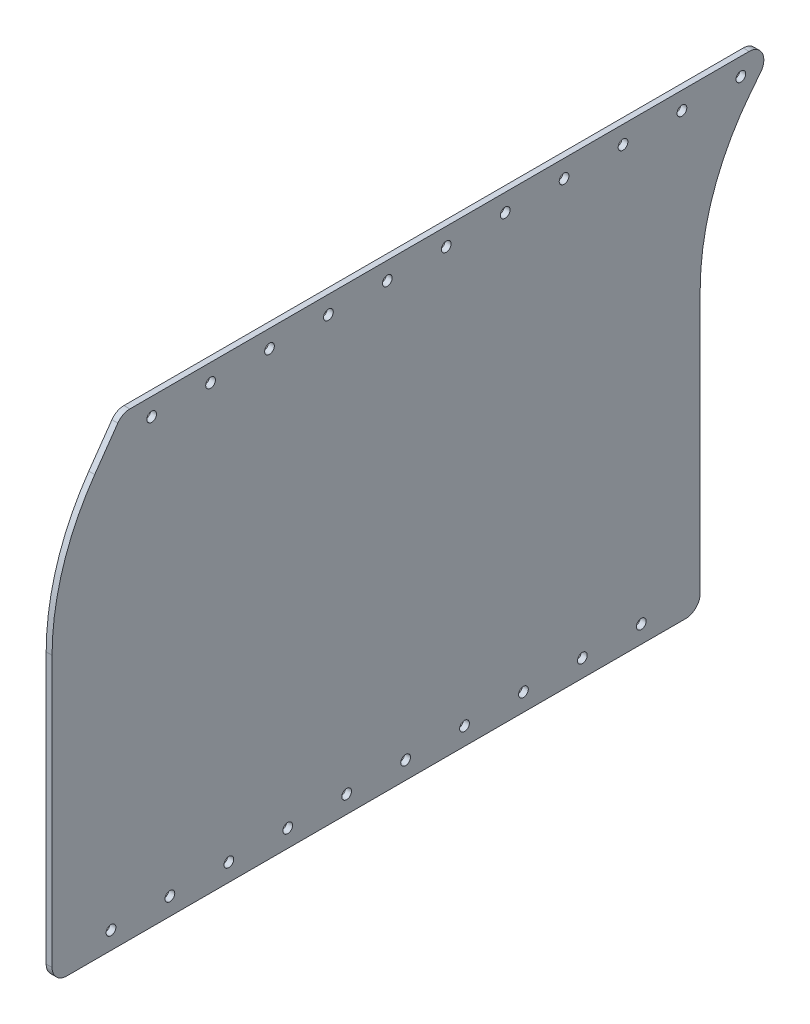
ISO-10303-21;
HEADER;
FILE_DESCRIPTION(('STEP AP214'),'2;1');
FILE_NAME('part.step','',(''),(''),'','','');
FILE_SCHEMA(('AUTOMOTIVE_DESIGN { 1 0 10303 214 1 1 1 1 }'));
ENDSEC;
DATA;
#1=APPLICATION_CONTEXT('core data for automotive mechanical design processes');
#2=APPLICATION_PROTOCOL_DEFINITION('international standard','automotive_design',2000,#1);
#3=PRODUCT_CONTEXT('',#1,'mechanical');
#4=PRODUCT('Part','Part','',(#3));
#5=PRODUCT_RELATED_PRODUCT_CATEGORY('part','',(#4));
#6=PRODUCT_DEFINITION_FORMATION('','',#4);
#7=PRODUCT_DEFINITION_CONTEXT('part definition',#1,'design');
#8=PRODUCT_DEFINITION('design','',#6,#7);
#9=PRODUCT_DEFINITION_SHAPE('','',#8);
#10=(LENGTH_UNIT() NAMED_UNIT(*) SI_UNIT(.MILLI.,.METRE.));
#11=(NAMED_UNIT(*) PLANE_ANGLE_UNIT() SI_UNIT($,.RADIAN.));
#12=(NAMED_UNIT(*) SI_UNIT($,.STERADIAN.) SOLID_ANGLE_UNIT());
#13=UNCERTAINTY_MEASURE_WITH_UNIT(LENGTH_MEASURE(1.E-05),#10,'distance_accuracy_value','');
#14=(GEOMETRIC_REPRESENTATION_CONTEXT(3) GLOBAL_UNCERTAINTY_ASSIGNED_CONTEXT((#13)) GLOBAL_UNIT_ASSIGNED_CONTEXT((#10,
#11,#12)) REPRESENTATION_CONTEXT('',''));
#15=CARTESIAN_POINT('',(0.,0.,0.));
#16=DIRECTION('',(0.,0.,1.));
#17=DIRECTION('',(1.,0.,0.));
#18=AXIS2_PLACEMENT_3D('',#15,#16,#17);
#19=CARTESIAN_POINT('',(1.27,0.,0.));
#20=DIRECTION('',(1.,0.,0.));
#21=DIRECTION('',(0.,0.,-1.));
#22=AXIS2_PLACEMENT_3D('',#19,#20,#21);
#23=PLANE('',#22);
#24=CARTESIAN_POINT('',(1.27,187.448905627848,-132.581027707262));
#25=DIRECTION('',(1.,0.,0.));
#26=DIRECTION('',(0.,0.,-1.));
#27=AXIS2_PLACEMENT_3D('',#24,#25,#26);
#28=CIRCLE('',#27,2.09549999999952);
#29=CARTESIAN_POINT('',(1.27,187.448905627848,-134.676527707262));
#30=VERTEX_POINT('',#29);
#31=EDGE_CURVE('E244',#30,#30,#28,.T.);
#32=ORIENTED_EDGE('',*,*,#31,.F.);
#33=EDGE_LOOP('',(#32));
#34=FACE_BOUND('',#33,.T.);
#35=CARTESIAN_POINT('',(1.27,187.448905627848,-81.7810277072624));
#36=DIRECTION('',(1.,0.,0.));
#37=DIRECTION('',(0.,0.,-1.));
#38=AXIS2_PLACEMENT_3D('',#35,#36,#37);
#39=CIRCLE('',#38,2.09549999999952);
#40=CARTESIAN_POINT('',(1.27,187.448905627848,-83.8765277072619));
#41=VERTEX_POINT('',#40);
#42=EDGE_CURVE('E270',#41,#41,#39,.T.);
#43=ORIENTED_EDGE('',*,*,#42,.F.);
#44=EDGE_LOOP('',(#43));
#45=FACE_BOUND('',#44,.T.);
#46=CARTESIAN_POINT('',(1.27,187.448905627848,-30.9810277072624));
#47=DIRECTION('',(1.,0.,0.));
#48=DIRECTION('',(0.,0.,-1.));
#49=AXIS2_PLACEMENT_3D('',#46,#47,#48);
#50=CIRCLE('',#49,2.09549999999952);
#51=CARTESIAN_POINT('',(1.27,187.448905627848,-33.0765277072619));
#52=VERTEX_POINT('',#51);
#53=EDGE_CURVE('E239',#52,#52,#50,.T.);
#54=ORIENTED_EDGE('',*,*,#53,.F.);
#55=EDGE_LOOP('',(#54));
#56=FACE_BOUND('',#55,.T.);
#57=CARTESIAN_POINT('',(1.27,187.448905627848,19.8189722927376));
#58=DIRECTION('',(1.,0.,0.));
#59=DIRECTION('',(0.,0.,-1.));
#60=AXIS2_PLACEMENT_3D('',#57,#58,#59);
#61=CIRCLE('',#60,2.09549999999952);
#62=CARTESIAN_POINT('',(1.27,187.448905627848,17.7234722927381));
#63=VERTEX_POINT('',#62);
#64=EDGE_CURVE('E254',#63,#63,#61,.T.);
#65=ORIENTED_EDGE('',*,*,#64,.F.);
#66=EDGE_LOOP('',(#65));
#67=FACE_BOUND('',#66,.T.);
#68=CARTESIAN_POINT('',(1.27,187.448905627848,70.6189722927376));
#69=DIRECTION('',(1.,0.,0.));
#70=DIRECTION('',(0.,0.,-1.));
#71=AXIS2_PLACEMENT_3D('',#68,#69,#70);
#72=CIRCLE('',#71,2.09549999999952);
#73=CARTESIAN_POINT('',(1.27,187.448905627848,68.5234722927381));
#74=VERTEX_POINT('',#73);
#75=EDGE_CURVE('E296',#74,#74,#72,.T.);
#76=ORIENTED_EDGE('',*,*,#75,.F.);
#77=EDGE_LOOP('',(#76));
#78=FACE_BOUND('',#77,.T.);
#79=CARTESIAN_POINT('',(1.27,4.56890562784826,-115.05163953069));
#80=DIRECTION('',(1.,0.,0.));
#81=DIRECTION('',(0.,0.,-1.));
#82=AXIS2_PLACEMENT_3D('',#79,#80,#81);
#83=CIRCLE('',#82,2.09550000000003);
#84=CARTESIAN_POINT('',(1.27,4.56890562784826,-117.14713953069));
#85=VERTEX_POINT('',#84);
#86=EDGE_CURVE('E306',#85,#85,#83,.T.);
#87=ORIENTED_EDGE('',*,*,#86,.F.);
#88=EDGE_LOOP('',(#87));
#89=FACE_BOUND('',#88,.T.);
#90=CARTESIAN_POINT('',(1.27,4.56890562784826,-64.25163953069));
#91=DIRECTION('',(1.,0.,0.));
#92=DIRECTION('',(0.,0.,-1.));
#93=AXIS2_PLACEMENT_3D('',#90,#91,#92);
#94=CIRCLE('',#93,2.09550000000003);
#95=CARTESIAN_POINT('',(1.27,4.56890562784826,-66.34713953069));
#96=VERTEX_POINT('',#95);
#97=EDGE_CURVE('E318',#96,#96,#94,.T.);
#98=ORIENTED_EDGE('',*,*,#97,.F.);
#99=EDGE_LOOP('',(#98));
#100=FACE_BOUND('',#99,.T.);
#101=CARTESIAN_POINT('',(1.27,4.56890562784826,-13.45163953069));
#102=DIRECTION('',(1.,0.,0.));
#103=DIRECTION('',(0.,0.,-1.));
#104=AXIS2_PLACEMENT_3D('',#101,#102,#103);
#105=CIRCLE('',#104,2.09550000000003);
#106=CARTESIAN_POINT('',(1.27,4.56890562784826,-15.54713953069));
#107=VERTEX_POINT('',#106);
#108=EDGE_CURVE('E330',#107,#107,#105,.T.);
#109=ORIENTED_EDGE('',*,*,#108,.F.);
#110=EDGE_LOOP('',(#109));
#111=FACE_BOUND('',#110,.T.);
#112=CARTESIAN_POINT('',(1.27,4.56890562784826,37.34836046931));
#113=DIRECTION('',(1.,0.,0.));
#114=DIRECTION('',(0.,0.,-1.));
#115=AXIS2_PLACEMENT_3D('',#112,#113,#114);
#116=CIRCLE('',#115,2.09550000000003);
#117=CARTESIAN_POINT('',(1.27,4.56890562784826,35.25286046931));
#118=VERTEX_POINT('',#117);
#119=EDGE_CURVE('E342',#118,#118,#116,.T.);
#120=ORIENTED_EDGE('',*,*,#119,.F.);
#121=EDGE_LOOP('',(#120));
#122=FACE_BOUND('',#121,.T.);
#123=CARTESIAN_POINT('',(1.27,4.56890562784826,88.14836046931));
#124=DIRECTION('',(1.,0.,0.));
#125=DIRECTION('',(0.,0.,-1.));
#126=AXIS2_PLACEMENT_3D('',#123,#124,#125);
#127=CIRCLE('',#126,2.09550000000002);
#128=CARTESIAN_POINT('',(1.27,4.56890562784826,86.05286046931));
#129=VERTEX_POINT('',#128);
#130=EDGE_CURVE('E277',#129,#129,#127,.T.);
#131=ORIENTED_EDGE('',*,*,#130,.F.);
#132=EDGE_LOOP('',(#131));
#133=FACE_BOUND('',#132,.T.);
#134=DIRECTION('',(0.,-0.819152044288991,0.573576436351047));
#135=VECTOR('',#134,1.);
#136=CARTESIAN_POINT('',(1.27,151.896865158465,138.948360469295));
#137=LINE('',#136,#135);
#138=CARTESIAN_POINT('',(1.27,192.361115998677,110.614987002969));
#139=VERTEX_POINT('',#138);
#140=CARTESIAN_POINT('',(1.27,178.137874141626,120.574208169056));
#141=VERTEX_POINT('',#140);
#142=EDGE_CURVE('E280',#139,#141,#137,.T.);
#143=ORIENTED_EDGE('',*,*,#142,.T.);
#144=CARTESIAN_POINT('',(1.27,119.86250820836,37.3483604692947));
#145=DIRECTION('',(1.,0.,0.));
#146=DIRECTION('',(0.,0.,-1.));
#147=AXIS2_PLACEMENT_3D('',#144,#145,#146);
#148=CIRCLE('',#147,101.6);
#149=CARTESIAN_POINT('',(1.27,119.86250820836,138.948360469295));
#150=VERTEX_POINT('',#149);
#151=EDGE_CURVE('E216',#141,#150,#148,.T.);
#152=ORIENTED_EDGE('',*,*,#151,.T.);
#153=DIRECTION('',(0.,-1.,0.));
#154=VECTOR('',#153,1.);
#155=CARTESIAN_POINT('',(1.27,-3.05109437215151,138.948360469295));
#156=LINE('',#155,#154);
#157=CARTESIAN_POINT('',(1.27,3.29890562784849,138.948360469295));
#158=VERTEX_POINT('',#157);
#159=EDGE_CURVE('E282',#150,#158,#156,.T.);
#160=ORIENTED_EDGE('',*,*,#159,.T.);
#161=CARTESIAN_POINT('',(1.27,3.29890562784849,132.598360469295));
#162=DIRECTION('',(1.,0.,0.));
#163=DIRECTION('',(0.,0.,-1.));
#164=AXIS2_PLACEMENT_3D('',#161,#162,#163);
#165=CIRCLE('',#164,6.35);
#166=CARTESIAN_POINT('',(1.27,-3.05109437215151,132.598360469295));
#167=VERTEX_POINT('',#166);
#168=EDGE_CURVE('E186',#158,#167,#165,.T.);
#169=ORIENTED_EDGE('',*,*,#168,.T.);
#170=DIRECTION('',(0.,0.,-1.));
#171=VECTOR('',#170,1.);
#172=CARTESIAN_POINT('',(1.27,-3.05109437215151,138.948360469295));
#173=LINE('',#172,#171);
#174=CARTESIAN_POINT('',(1.27,-3.05109437215151,-134.101639530705));
#175=VERTEX_POINT('',#174);
#176=EDGE_CURVE('E363',#167,#175,#173,.T.);
#177=ORIENTED_EDGE('',*,*,#176,.T.);
#178=CARTESIAN_POINT('',(1.27,3.29890562784849,-134.101639530705));
#179=DIRECTION('',(1.,0.,0.));
#180=DIRECTION('',(0.,0.,-1.));
#181=AXIS2_PLACEMENT_3D('',#178,#179,#180);
#182=CIRCLE('',#181,6.35);
#183=CARTESIAN_POINT('',(1.27,3.29890562784849,-140.451639530705));
#184=VERTEX_POINT('',#183);
#185=EDGE_CURVE('E188',#175,#184,#182,.T.);
#186=ORIENTED_EDGE('',*,*,#185,.T.);
#187=DIRECTION('',(0.,1.,0.));
#188=VECTOR('',#187,1.);
#189=CARTESIAN_POINT('',(1.27,-3.05109437215151,-140.451639530705));
#190=LINE('',#189,#188);
#191=CARTESIAN_POINT('',(1.27,116.512280899676,-140.451639530705));
#192=VERTEX_POINT('',#191);
#193=EDGE_CURVE('E154',#184,#192,#190,.T.);
#194=ORIENTED_EDGE('',*,*,#193,.T.);
#195=CARTESIAN_POINT('',(1.27,116.512280899676,-242.051639530705));
#196=DIRECTION('',(1.,0.,0.));
#197=DIRECTION('',(0.,0.,-1.));
#198=AXIS2_PLACEMENT_3D('',#195,#196,#197);
#199=CIRCLE('',#198,101.6);
#200=CARTESIAN_POINT('',(1.27,179.626096521383,-162.432506920075));
#201=VERTEX_POINT('',#200);
#202=EDGE_CURVE('E11',#192,#201,#199,.F.);
#203=ORIENTED_EDGE('',*,*,#202,.T.);
#204=DIRECTION('',(0.,0.783652880025889,-0.6211989726546));
#205=VECTOR('',#204,1.);
#206=CARTESIAN_POINT('',(1.27,151.896865158465,-140.451639530705));
#207=LINE('',#206,#205);
#208=CARTESIAN_POINT('',(1.27,184.77429215149,-166.513464086137));
#209=VERTEX_POINT('',#208);
#210=EDGE_CURVE('E161',#201,#209,#207,.T.);
#211=ORIENTED_EDGE('',*,*,#210,.T.);
#212=CARTESIAN_POINT('',(1.27,188.718905627846,-161.537268297973));
#213=DIRECTION('',(1.,0.,0.));
#214=DIRECTION('',(0.,0.,-1.));
#215=AXIS2_PLACEMENT_3D('',#212,#213,#214);
#216=CIRCLE('',#215,6.35);
#217=CARTESIAN_POINT('',(1.27,195.068905627846,-161.537268297973));
#218=VERTEX_POINT('',#217);
#219=EDGE_CURVE('E181',#209,#218,#216,.T.);
#220=ORIENTED_EDGE('',*,*,#219,.T.);
#221=DIRECTION('',(0.,0.,1.));
#222=VECTOR('',#221,1.);
#223=CARTESIAN_POINT('',(1.27,195.068905627846,-174.673969175046));
#224=LINE('',#223,#222);
#225=CARTESIAN_POINT('',(1.27,195.068905627848,105.413371521734));
#226=VERTEX_POINT('',#225);
#227=EDGE_CURVE('E165',#218,#226,#224,.T.);
#228=ORIENTED_EDGE('',*,*,#227,.T.);
#229=CARTESIAN_POINT('',(1.27,188.718905627848,105.413371521734));
#230=DIRECTION('',(1.,0.,0.));
#231=DIRECTION('',(0.,0.,-1.));
#232=AXIS2_PLACEMENT_3D('',#229,#230,#231);
#233=CIRCLE('',#232,6.35);
#234=EDGE_CURVE('E183',#226,#139,#233,.T.);
#235=ORIENTED_EDGE('',*,*,#234,.T.);
#236=EDGE_LOOP('',(#143,#152,#160,#169,#177,#186,#194,#203,#211,#220,#228,#235));
#237=FACE_BOUND('',#236,.T.);
#238=CARTESIAN_POINT('',(1.27,4.56890562784804,113.548360469312));
#239=DIRECTION('',(1.,0.,0.));
#240=DIRECTION('',(0.,0.,-1.));
#241=AXIS2_PLACEMENT_3D('',#238,#239,#240);
#242=CIRCLE('',#241,2.09550000000216);
#243=CARTESIAN_POINT('',(1.27,4.56890562784804,111.45286046931));
#244=VERTEX_POINT('',#243);
#245=EDGE_CURVE('E228',#244,#244,#242,.T.);
#246=ORIENTED_EDGE('',*,*,#245,.F.);
#247=EDGE_LOOP('',(#246));
#248=FACE_BOUND('',#247,.T.);
#249=CARTESIAN_POINT('',(1.27,4.56890562784826,62.74836046931));
#250=DIRECTION('',(1.,0.,0.));
#251=DIRECTION('',(0.,0.,-1.));
#252=AXIS2_PLACEMENT_3D('',#249,#250,#251);
#253=CIRCLE('',#252,2.09550000000003);
#254=CARTESIAN_POINT('',(1.27,4.56890562784826,60.65286046931));
#255=VERTEX_POINT('',#254);
#256=EDGE_CURVE('E348',#255,#255,#253,.T.);
#257=ORIENTED_EDGE('',*,*,#256,.F.);
#258=EDGE_LOOP('',(#257));
#259=FACE_BOUND('',#258,.T.);
#260=CARTESIAN_POINT('',(1.27,4.56890562784826,11.94836046931));
#261=DIRECTION('',(1.,0.,0.));
#262=DIRECTION('',(0.,0.,-1.));
#263=AXIS2_PLACEMENT_3D('',#260,#261,#262);
#264=CIRCLE('',#263,2.09550000000003);
#265=CARTESIAN_POINT('',(1.27,4.56890562784826,9.85286046930997));
#266=VERTEX_POINT('',#265);
#267=EDGE_CURVE('E336',#266,#266,#264,.T.);
#268=ORIENTED_EDGE('',*,*,#267,.F.);
#269=EDGE_LOOP('',(#268));
#270=FACE_BOUND('',#269,.T.);
#271=CARTESIAN_POINT('',(1.27,4.56890562784826,-38.85163953069));
#272=DIRECTION('',(1.,0.,0.));
#273=DIRECTION('',(0.,0.,-1.));
#274=AXIS2_PLACEMENT_3D('',#271,#272,#273);
#275=CIRCLE('',#274,2.09550000000003);
#276=CARTESIAN_POINT('',(1.27,4.56890562784826,-40.94713953069));
#277=VERTEX_POINT('',#276);
#278=EDGE_CURVE('E324',#277,#277,#275,.T.);
#279=ORIENTED_EDGE('',*,*,#278,.F.);
#280=EDGE_LOOP('',(#279));
#281=FACE_BOUND('',#280,.T.);
#282=CARTESIAN_POINT('',(1.27,4.56890562784826,-89.65163953069));
#283=DIRECTION('',(1.,0.,0.));
#284=DIRECTION('',(0.,0.,-1.));
#285=AXIS2_PLACEMENT_3D('',#282,#283,#284);
#286=CIRCLE('',#285,2.09550000000003);
#287=CARTESIAN_POINT('',(1.27,4.56890562784826,-91.74713953069));
#288=VERTEX_POINT('',#287);
#289=EDGE_CURVE('E312',#288,#288,#286,.T.);
#290=ORIENTED_EDGE('',*,*,#289,.F.);
#291=EDGE_LOOP('',(#290));
#292=FACE_BOUND('',#291,.T.);
#293=CARTESIAN_POINT('',(1.27,187.448905627848,96.0189722927398));
#294=DIRECTION('',(1.,0.,0.));
#295=DIRECTION('',(0.,0.,-1.));
#296=AXIS2_PLACEMENT_3D('',#293,#294,#295);
#297=CIRCLE('',#296,2.09550000000165);
#298=CARTESIAN_POINT('',(1.27,187.448905627848,93.9234722927381));
#299=VERTEX_POINT('',#298);
#300=EDGE_CURVE('E289',#299,#299,#297,.T.);
#301=ORIENTED_EDGE('',*,*,#300,.F.);
#302=EDGE_LOOP('',(#301));
#303=FACE_BOUND('',#302,.T.);
#304=CARTESIAN_POINT('',(1.27,187.448905627848,45.2189722927376));
#305=DIRECTION('',(1.,0.,0.));
#306=DIRECTION('',(0.,0.,-1.));
#307=AXIS2_PLACEMENT_3D('',#304,#305,#306);
#308=CIRCLE('',#307,2.09549999999952);
#309=CARTESIAN_POINT('',(1.27,187.448905627848,43.1234722927381));
#310=VERTEX_POINT('',#309);
#311=EDGE_CURVE('E764',#310,#310,#308,.T.);
#312=ORIENTED_EDGE('',*,*,#311,.F.);
#313=EDGE_LOOP('',(#312));
#314=FACE_BOUND('',#313,.T.);
#315=CARTESIAN_POINT('',(1.27,187.448905627848,-5.5810277072624));
#316=DIRECTION('',(1.,0.,0.));
#317=DIRECTION('',(0.,0.,-1.));
#318=AXIS2_PLACEMENT_3D('',#315,#316,#317);
#319=CIRCLE('',#318,2.09549999999952);
#320=CARTESIAN_POINT('',(1.27,187.448905627848,-7.67652770726192));
#321=VERTEX_POINT('',#320);
#322=EDGE_CURVE('E231',#321,#321,#319,.T.);
#323=ORIENTED_EDGE('',*,*,#322,.F.);
#324=EDGE_LOOP('',(#323));
#325=FACE_BOUND('',#324,.T.);
#326=CARTESIAN_POINT('',(1.27,187.448905627848,-56.3810277072624));
#327=DIRECTION('',(1.,0.,0.));
#328=DIRECTION('',(0.,0.,-1.));
#329=AXIS2_PLACEMENT_3D('',#326,#327,#328);
#330=CIRCLE('',#329,2.09549999999952);
#331=CARTESIAN_POINT('',(1.27,187.448905627848,-58.4765277072619));
#332=VERTEX_POINT('',#331);
#333=EDGE_CURVE('E262',#332,#332,#330,.T.);
#334=ORIENTED_EDGE('',*,*,#333,.F.);
#335=EDGE_LOOP('',(#334));
#336=FACE_BOUND('',#335,.T.);
#337=CARTESIAN_POINT('',(1.27,187.448905627848,-107.181027707262));
#338=DIRECTION('',(1.,0.,0.));
#339=DIRECTION('',(0.,0.,-1.));
#340=AXIS2_PLACEMENT_3D('',#337,#338,#339);
#341=CIRCLE('',#340,2.09549999999952);
#342=CARTESIAN_POINT('',(1.27,187.448905627848,-109.276527707262));
#343=VERTEX_POINT('',#342);
#344=EDGE_CURVE('E748',#343,#343,#341,.T.);
#345=ORIENTED_EDGE('',*,*,#344,.F.);
#346=EDGE_LOOP('',(#345));
#347=FACE_BOUND('',#346,.T.);
#348=CARTESIAN_POINT('',(1.27,187.448905627848,-157.981027707262));
#349=DIRECTION('',(1.,0.,0.));
#350=DIRECTION('',(0.,0.,-1.));
#351=AXIS2_PLACEMENT_3D('',#348,#349,#350);
#352=CIRCLE('',#351,2.09549999999952);
#353=CARTESIAN_POINT('',(1.27,187.448905627848,-160.076527707262));
#354=VERTEX_POINT('',#353);
#355=EDGE_CURVE('E245',#354,#354,#352,.T.);
#356=ORIENTED_EDGE('',*,*,#355,.F.);
#357=EDGE_LOOP('',(#356));
#358=FACE_BOUND('',#357,.T.);
#359=ADVANCED_FACE('F39',(#34,#45,#56,#67,#78,#89,#100,#111,#122,#133,#237,#248,#259,#270,#281,
#292,#303,#314,#325,#336,#347,#358),#23,.T.);
#360=CARTESIAN_POINT('',(-1.27,0.,0.));
#361=DIRECTION('',(1.,0.,0.));
#362=DIRECTION('',(0.,0.,-1.));
#363=AXIS2_PLACEMENT_3D('',#360,#361,#362);
#364=PLANE('',#363);
#365=DIRECTION('',(0.,-1.,0.));
#366=VECTOR('',#365,1.);
#367=CARTESIAN_POINT('',(-1.27,-3.05109437215151,138.948360469295));
#368=LINE('',#367,#366);
#369=CARTESIAN_POINT('',(-1.27,119.86250820836,138.948360469295));
#370=VERTEX_POINT('',#369);
#371=CARTESIAN_POINT('',(-1.27,3.29890562784849,138.948360469295));
#372=VERTEX_POINT('',#371);
#373=EDGE_CURVE('E167',#370,#372,#368,.T.);
#374=ORIENTED_EDGE('',*,*,#373,.F.);
#375=CARTESIAN_POINT('',(-1.27,119.86250820836,37.3483604692947));
#376=DIRECTION('',(1.,0.,0.));
#377=DIRECTION('',(0.,0.,-1.));
#378=AXIS2_PLACEMENT_3D('',#375,#376,#377);
#379=CIRCLE('',#378,101.6);
#380=CARTESIAN_POINT('',(-1.27,178.137874141626,120.574208169056));
#381=VERTEX_POINT('',#380);
#382=EDGE_CURVE('E210',#370,#381,#379,.F.);
#383=ORIENTED_EDGE('',*,*,#382,.T.);
#384=DIRECTION('',(0.,-0.819152044288991,0.573576436351047));
#385=VECTOR('',#384,1.);
#386=CARTESIAN_POINT('',(-1.27,151.896865158465,138.948360469295));
#387=LINE('',#386,#385);
#388=CARTESIAN_POINT('',(-1.27,192.361115998677,110.614987002969));
#389=VERTEX_POINT('',#388);
#390=EDGE_CURVE('E285',#389,#381,#387,.T.);
#391=ORIENTED_EDGE('',*,*,#390,.F.);
#392=CARTESIAN_POINT('',(-1.27,188.718905627848,105.413371521734));
#393=DIRECTION('',(1.,0.,0.));
#394=DIRECTION('',(0.,0.,-1.));
#395=AXIS2_PLACEMENT_3D('',#392,#393,#394);
#396=CIRCLE('',#395,6.35);
#397=CARTESIAN_POINT('',(-1.27,195.068905627848,105.413371521734));
#398=VERTEX_POINT('',#397);
#399=EDGE_CURVE('E173',#389,#398,#396,.F.);
#400=ORIENTED_EDGE('',*,*,#399,.T.);
#401=DIRECTION('',(0.,0.,1.));
#402=VECTOR('',#401,1.);
#403=CARTESIAN_POINT('',(-1.27,195.068905627846,-174.673969175046));
#404=LINE('',#403,#402);
#405=CARTESIAN_POINT('',(-1.27,195.068905627846,-161.537268297973));
#406=VERTEX_POINT('',#405);
#407=EDGE_CURVE('E227',#406,#398,#404,.T.);
#408=ORIENTED_EDGE('',*,*,#407,.F.);
#409=CARTESIAN_POINT('',(-1.27,188.718905627846,-161.537268297973));
#410=DIRECTION('',(1.,0.,0.));
#411=DIRECTION('',(0.,0.,-1.));
#412=AXIS2_PLACEMENT_3D('',#409,#410,#411);
#413=CIRCLE('',#412,6.35);
#414=CARTESIAN_POINT('',(-1.27,184.77429215149,-166.513464086137));
#415=VERTEX_POINT('',#414);
#416=EDGE_CURVE('E155',#406,#415,#413,.F.);
#417=ORIENTED_EDGE('',*,*,#416,.T.);
#418=DIRECTION('',(0.,0.783652880025889,-0.6211989726546));
#419=VECTOR('',#418,1.);
#420=CARTESIAN_POINT('',(-1.27,151.896865158465,-140.451639530705));
#421=LINE('',#420,#419);
#422=CARTESIAN_POINT('',(-1.27,179.626096521383,-162.432506920075));
#423=VERTEX_POINT('',#422);
#424=EDGE_CURVE('E226',#423,#415,#421,.T.);
#425=ORIENTED_EDGE('',*,*,#424,.F.);
#426=CARTESIAN_POINT('',(-1.27,116.512280899676,-242.051639530705));
#427=DIRECTION('',(1.,0.,0.));
#428=DIRECTION('',(0.,0.,-1.));
#429=AXIS2_PLACEMENT_3D('',#426,#427,#428);
#430=CIRCLE('',#429,101.6);
#431=CARTESIAN_POINT('',(-1.27,116.512280899676,-140.451639530705));
#432=VERTEX_POINT('',#431);
#433=EDGE_CURVE('E48',#423,#432,#430,.T.);
#434=ORIENTED_EDGE('',*,*,#433,.T.);
#435=DIRECTION('',(0.,1.,0.));
#436=VECTOR('',#435,1.);
#437=CARTESIAN_POINT('',(-1.27,-3.05109437215151,-140.451639530705));
#438=LINE('',#437,#436);
#439=CARTESIAN_POINT('',(-1.27,3.29890562784849,-140.451639530705));
#440=VERTEX_POINT('',#439);
#441=EDGE_CURVE('E153',#440,#432,#438,.T.);
#442=ORIENTED_EDGE('',*,*,#441,.F.);
#443=CARTESIAN_POINT('',(-1.27,3.29890562784849,-134.101639530705));
#444=DIRECTION('',(1.,0.,0.));
#445=DIRECTION('',(0.,0.,-1.));
#446=AXIS2_PLACEMENT_3D('',#443,#444,#445);
#447=CIRCLE('',#446,6.35);
#448=CARTESIAN_POINT('',(-1.27,-3.05109437215151,-134.101639530705));
#449=VERTEX_POINT('',#448);
#450=EDGE_CURVE('E139',#440,#449,#447,.F.);
#451=ORIENTED_EDGE('',*,*,#450,.T.);
#452=DIRECTION('',(0.,0.,-1.));
#453=VECTOR('',#452,1.);
#454=CARTESIAN_POINT('',(-1.27,-3.05109437215151,138.948360469295));
#455=LINE('',#454,#453);
#456=CARTESIAN_POINT('',(-1.27,-3.05109437215151,132.598360469295));
#457=VERTEX_POINT('',#456);
#458=EDGE_CURVE('E162',#457,#449,#455,.T.);
#459=ORIENTED_EDGE('',*,*,#458,.F.);
#460=CARTESIAN_POINT('',(-1.27,3.29890562784849,132.598360469295));
#461=DIRECTION('',(1.,0.,0.));
#462=DIRECTION('',(0.,0.,-1.));
#463=AXIS2_PLACEMENT_3D('',#460,#461,#462);
#464=CIRCLE('',#463,6.35);
#465=EDGE_CURVE('E150',#457,#372,#464,.F.);
#466=ORIENTED_EDGE('',*,*,#465,.T.);
#467=EDGE_LOOP('',(#374,#383,#391,#400,#408,#417,#425,#434,#442,#451,#459,#466));
#468=FACE_BOUND('',#467,.T.);
#469=CARTESIAN_POINT('',(-1.27,4.56890562784804,113.548360469312));
#470=DIRECTION('',(1.,0.,0.));
#471=DIRECTION('',(0.,0.,-1.));
#472=AXIS2_PLACEMENT_3D('',#469,#470,#471);
#473=CIRCLE('',#472,2.09550000000216);
#474=CARTESIAN_POINT('',(-1.27,4.56890562784804,111.45286046931));
#475=VERTEX_POINT('',#474);
#476=EDGE_CURVE('E274',#475,#475,#473,.T.);
#477=ORIENTED_EDGE('',*,*,#476,.T.);
#478=EDGE_LOOP('',(#477));
#479=FACE_BOUND('',#478,.T.);
#480=CARTESIAN_POINT('',(-1.27,4.56890562784826,88.14836046931));
#481=DIRECTION('',(1.,0.,0.));
#482=DIRECTION('',(0.,0.,-1.));
#483=AXIS2_PLACEMENT_3D('',#480,#481,#482);
#484=CIRCLE('',#483,2.09550000000002);
#485=CARTESIAN_POINT('',(-1.27,4.56890562784826,86.05286046931));
#486=VERTEX_POINT('',#485);
#487=EDGE_CURVE('E351',#486,#486,#484,.T.);
#488=ORIENTED_EDGE('',*,*,#487,.T.);
#489=EDGE_LOOP('',(#488));
#490=FACE_BOUND('',#489,.T.);
#491=CARTESIAN_POINT('',(-1.27,4.56890562784826,62.74836046931));
#492=DIRECTION('',(1.,0.,0.));
#493=DIRECTION('',(0.,0.,-1.));
#494=AXIS2_PLACEMENT_3D('',#491,#492,#493);
#495=CIRCLE('',#494,2.09550000000003);
#496=CARTESIAN_POINT('',(-1.27,4.56890562784826,60.65286046931));
#497=VERTEX_POINT('',#496);
#498=EDGE_CURVE('E345',#497,#497,#495,.T.);
#499=ORIENTED_EDGE('',*,*,#498,.T.);
#500=EDGE_LOOP('',(#499));
#501=FACE_BOUND('',#500,.T.);
#502=CARTESIAN_POINT('',(-1.27,4.56890562784826,37.34836046931));
#503=DIRECTION('',(1.,0.,0.));
#504=DIRECTION('',(0.,0.,-1.));
#505=AXIS2_PLACEMENT_3D('',#502,#503,#504);
#506=CIRCLE('',#505,2.09550000000003);
#507=CARTESIAN_POINT('',(-1.27,4.56890562784826,35.25286046931));
#508=VERTEX_POINT('',#507);
#509=EDGE_CURVE('E339',#508,#508,#506,.T.);
#510=ORIENTED_EDGE('',*,*,#509,.T.);
#511=EDGE_LOOP('',(#510));
#512=FACE_BOUND('',#511,.T.);
#513=CARTESIAN_POINT('',(-1.27,4.56890562784826,11.94836046931));
#514=DIRECTION('',(1.,0.,0.));
#515=DIRECTION('',(0.,0.,-1.));
#516=AXIS2_PLACEMENT_3D('',#513,#514,#515);
#517=CIRCLE('',#516,2.09550000000003);
#518=CARTESIAN_POINT('',(-1.27,4.56890562784826,9.85286046930997));
#519=VERTEX_POINT('',#518);
#520=EDGE_CURVE('E333',#519,#519,#517,.T.);
#521=ORIENTED_EDGE('',*,*,#520,.T.);
#522=EDGE_LOOP('',(#521));
#523=FACE_BOUND('',#522,.T.);
#524=CARTESIAN_POINT('',(-1.27,4.56890562784826,-13.45163953069));
#525=DIRECTION('',(1.,0.,0.));
#526=DIRECTION('',(0.,0.,-1.));
#527=AXIS2_PLACEMENT_3D('',#524,#525,#526);
#528=CIRCLE('',#527,2.09550000000003);
#529=CARTESIAN_POINT('',(-1.27,4.56890562784826,-15.54713953069));
#530=VERTEX_POINT('',#529);
#531=EDGE_CURVE('E327',#530,#530,#528,.T.);
#532=ORIENTED_EDGE('',*,*,#531,.T.);
#533=EDGE_LOOP('',(#532));
#534=FACE_BOUND('',#533,.T.);
#535=CARTESIAN_POINT('',(-1.27,4.56890562784826,-38.85163953069));
#536=DIRECTION('',(1.,0.,0.));
#537=DIRECTION('',(0.,0.,-1.));
#538=AXIS2_PLACEMENT_3D('',#535,#536,#537);
#539=CIRCLE('',#538,2.09550000000003);
#540=CARTESIAN_POINT('',(-1.27,4.56890562784826,-40.94713953069));
#541=VERTEX_POINT('',#540);
#542=EDGE_CURVE('E321',#541,#541,#539,.T.);
#543=ORIENTED_EDGE('',*,*,#542,.T.);
#544=EDGE_LOOP('',(#543));
#545=FACE_BOUND('',#544,.T.);
#546=CARTESIAN_POINT('',(-1.27,4.56890562784826,-64.25163953069));
#547=DIRECTION('',(1.,0.,0.));
#548=DIRECTION('',(0.,0.,-1.));
#549=AXIS2_PLACEMENT_3D('',#546,#547,#548);
#550=CIRCLE('',#549,2.09550000000003);
#551=CARTESIAN_POINT('',(-1.27,4.56890562784826,-66.34713953069));
#552=VERTEX_POINT('',#551);
#553=EDGE_CURVE('E315',#552,#552,#550,.T.);
#554=ORIENTED_EDGE('',*,*,#553,.T.);
#555=EDGE_LOOP('',(#554));
#556=FACE_BOUND('',#555,.T.);
#557=CARTESIAN_POINT('',(-1.27,4.56890562784826,-89.65163953069));
#558=DIRECTION('',(1.,0.,0.));
#559=DIRECTION('',(0.,0.,-1.));
#560=AXIS2_PLACEMENT_3D('',#557,#558,#559);
#561=CIRCLE('',#560,2.09550000000003);
#562=CARTESIAN_POINT('',(-1.27,4.56890562784826,-91.74713953069));
#563=VERTEX_POINT('',#562);
#564=EDGE_CURVE('E309',#563,#563,#561,.T.);
#565=ORIENTED_EDGE('',*,*,#564,.T.);
#566=EDGE_LOOP('',(#565));
#567=FACE_BOUND('',#566,.T.);
#568=CARTESIAN_POINT('',(-1.27,4.56890562784826,-115.05163953069));
#569=DIRECTION('',(1.,0.,0.));
#570=DIRECTION('',(0.,0.,-1.));
#571=AXIS2_PLACEMENT_3D('',#568,#569,#570);
#572=CIRCLE('',#571,2.09550000000003);
#573=CARTESIAN_POINT('',(-1.27,4.56890562784826,-117.14713953069));
#574=VERTEX_POINT('',#573);
#575=EDGE_CURVE('E291',#574,#574,#572,.T.);
#576=ORIENTED_EDGE('',*,*,#575,.T.);
#577=EDGE_LOOP('',(#576));
#578=FACE_BOUND('',#577,.T.);
#579=CARTESIAN_POINT('',(-1.27,187.448905627848,96.0189722927398));
#580=DIRECTION('',(1.,0.,0.));
#581=DIRECTION('',(0.,0.,-1.));
#582=AXIS2_PLACEMENT_3D('',#579,#580,#581);
#583=CIRCLE('',#582,2.09550000000165);
#584=CARTESIAN_POINT('',(-1.27,187.448905627848,93.9234722927381));
#585=VERTEX_POINT('',#584);
#586=EDGE_CURVE('E292',#585,#585,#583,.T.);
#587=ORIENTED_EDGE('',*,*,#586,.T.);
#588=EDGE_LOOP('',(#587));
#589=FACE_BOUND('',#588,.T.);
#590=CARTESIAN_POINT('',(-1.27,187.448905627848,70.6189722927376));
#591=DIRECTION('',(1.,0.,0.));
#592=DIRECTION('',(0.,0.,-1.));
#593=AXIS2_PLACEMENT_3D('',#590,#591,#592);
#594=CIRCLE('',#593,2.09549999999952);
#595=CARTESIAN_POINT('',(-1.27,187.448905627848,68.5234722927381));
#596=VERTEX_POINT('',#595);
#597=EDGE_CURVE('E302',#596,#596,#594,.T.);
#598=ORIENTED_EDGE('',*,*,#597,.T.);
#599=EDGE_LOOP('',(#598));
#600=FACE_BOUND('',#599,.T.);
#601=CARTESIAN_POINT('',(-1.27,187.448905627848,45.2189722927376));
#602=DIRECTION('',(1.,0.,0.));
#603=DIRECTION('',(0.,0.,-1.));
#604=AXIS2_PLACEMENT_3D('',#601,#602,#603);
#605=CIRCLE('',#604,2.09549999999952);
#606=CARTESIAN_POINT('',(-1.27,187.448905627848,43.1234722927381));
#607=VERTEX_POINT('',#606);
#608=EDGE_CURVE('E257',#607,#607,#605,.T.);
#609=ORIENTED_EDGE('',*,*,#608,.T.);
#610=EDGE_LOOP('',(#609));
#611=FACE_BOUND('',#610,.T.);
#612=CARTESIAN_POINT('',(-1.27,187.448905627848,19.8189722927376));
#613=DIRECTION('',(1.,0.,0.));
#614=DIRECTION('',(0.,0.,-1.));
#615=AXIS2_PLACEMENT_3D('',#612,#613,#614);
#616=CIRCLE('',#615,2.09549999999952);
#617=CARTESIAN_POINT('',(-1.27,187.448905627848,17.7234722927381));
#618=VERTEX_POINT('',#617);
#619=EDGE_CURVE('E234',#618,#618,#616,.T.);
#620=ORIENTED_EDGE('',*,*,#619,.T.);
#621=EDGE_LOOP('',(#620));
#622=FACE_BOUND('',#621,.T.);
#623=CARTESIAN_POINT('',(-1.27,187.448905627848,-5.5810277072624));
#624=DIRECTION('',(1.,0.,0.));
#625=DIRECTION('',(0.,0.,-1.));
#626=AXIS2_PLACEMENT_3D('',#623,#624,#625);
#627=CIRCLE('',#626,2.09549999999952);
#628=CARTESIAN_POINT('',(-1.27,187.448905627848,-7.67652770726192));
#629=VERTEX_POINT('',#628);
#630=EDGE_CURVE('E235',#629,#629,#627,.T.);
#631=ORIENTED_EDGE('',*,*,#630,.T.);
#632=EDGE_LOOP('',(#631));
#633=FACE_BOUND('',#632,.T.);
#634=CARTESIAN_POINT('',(-1.27,187.448905627848,-30.9810277072624));
#635=DIRECTION('',(1.,0.,0.));
#636=DIRECTION('',(0.,0.,-1.));
#637=AXIS2_PLACEMENT_3D('',#634,#635,#636);
#638=CIRCLE('',#637,2.09549999999952);
#639=CARTESIAN_POINT('',(-1.27,187.448905627848,-33.0765277072619));
#640=VERTEX_POINT('',#639);
#641=EDGE_CURVE('E265',#640,#640,#638,.T.);
#642=ORIENTED_EDGE('',*,*,#641,.T.);
#643=EDGE_LOOP('',(#642));
#644=FACE_BOUND('',#643,.T.);
#645=CARTESIAN_POINT('',(-1.27,187.448905627848,-56.3810277072624));
#646=DIRECTION('',(1.,0.,0.));
#647=DIRECTION('',(0.,0.,-1.));
#648=AXIS2_PLACEMENT_3D('',#645,#646,#647);
#649=CIRCLE('',#648,2.09549999999952);
#650=CARTESIAN_POINT('',(-1.27,187.448905627848,-58.4765277072619));
#651=VERTEX_POINT('',#650);
#652=EDGE_CURVE('E266',#651,#651,#649,.T.);
#653=ORIENTED_EDGE('',*,*,#652,.T.);
#654=EDGE_LOOP('',(#653));
#655=FACE_BOUND('',#654,.T.);
#656=CARTESIAN_POINT('',(-1.27,187.448905627848,-81.7810277072624));
#657=DIRECTION('',(1.,0.,0.));
#658=DIRECTION('',(0.,0.,-1.));
#659=AXIS2_PLACEMENT_3D('',#656,#657,#658);
#660=CIRCLE('',#659,2.09549999999952);
#661=CARTESIAN_POINT('',(-1.27,187.448905627848,-83.8765277072619));
#662=VERTEX_POINT('',#661);
#663=EDGE_CURVE('E752',#662,#662,#660,.T.);
#664=ORIENTED_EDGE('',*,*,#663,.T.);
#665=EDGE_LOOP('',(#664));
#666=FACE_BOUND('',#665,.T.);
#667=CARTESIAN_POINT('',(-1.27,187.448905627848,-107.181027707262));
#668=DIRECTION('',(1.,0.,0.));
#669=DIRECTION('',(0.,0.,-1.));
#670=AXIS2_PLACEMENT_3D('',#667,#668,#669);
#671=CIRCLE('',#670,2.09549999999952);
#672=CARTESIAN_POINT('',(-1.27,187.448905627848,-109.276527707262));
#673=VERTEX_POINT('',#672);
#674=EDGE_CURVE('E743',#673,#673,#671,.T.);
#675=ORIENTED_EDGE('',*,*,#674,.T.);
#676=EDGE_LOOP('',(#675));
#677=FACE_BOUND('',#676,.T.);
#678=CARTESIAN_POINT('',(-1.27,187.448905627848,-132.581027707262));
#679=DIRECTION('',(1.,0.,0.));
#680=DIRECTION('',(0.,0.,-1.));
#681=AXIS2_PLACEMENT_3D('',#678,#679,#680);
#682=CIRCLE('',#681,2.09549999999952);
#683=CARTESIAN_POINT('',(-1.27,187.448905627848,-134.676527707262));
#684=VERTEX_POINT('',#683);
#685=EDGE_CURVE('E241',#684,#684,#682,.T.);
#686=ORIENTED_EDGE('',*,*,#685,.T.);
#687=EDGE_LOOP('',(#686));
#688=FACE_BOUND('',#687,.T.);
#689=CARTESIAN_POINT('',(-1.27,187.448905627848,-157.981027707262));
#690=DIRECTION('',(1.,0.,0.));
#691=DIRECTION('',(0.,0.,-1.));
#692=AXIS2_PLACEMENT_3D('',#689,#690,#691);
#693=CIRCLE('',#692,2.09549999999952);
#694=CARTESIAN_POINT('',(-1.27,187.448905627848,-160.076527707262));
#695=VERTEX_POINT('',#694);
#696=EDGE_CURVE('E249',#695,#695,#693,.T.);
#697=ORIENTED_EDGE('',*,*,#696,.T.);
#698=EDGE_LOOP('',(#697));
#699=FACE_BOUND('',#698,.T.);
#700=ADVANCED_FACE('F158',(#468,#479,#490,#501,#512,#523,#534,#545,#556,#567,#578,#589,#600,
#611,#622,#633,#644,#655,#666,#677,#688,#699),#364,.F.);
#701=CARTESIAN_POINT('',(1.27,151.896865158465,-140.451639530705));
#702=DIRECTION('',(0.,0.6211989726546,0.783652880025889));
#703=DIRECTION('',(0.,-0.783652880025889,0.6211989726546));
#704=AXIS2_PLACEMENT_3D('',#701,#702,#703);
#705=PLANE('',#704);
#706=ORIENTED_EDGE('',*,*,#210,.F.);
#707=DIRECTION('',(-1.,0.,0.));
#708=VECTOR('',#707,1.);
#709=CARTESIAN_POINT('',(-1.27,179.626096521383,-162.432506920075));
#710=LINE('',#709,#708);
#711=EDGE_CURVE('E219',#201,#423,#710,.T.);
#712=ORIENTED_EDGE('',*,*,#711,.T.);
#713=ORIENTED_EDGE('',*,*,#424,.T.);
#714=DIRECTION('',(-1.,0.,0.));
#715=VECTOR('',#714,1.);
#716=CARTESIAN_POINT('',(1.27,184.77429215149,-166.513464086137));
#717=LINE('',#716,#715);
#718=EDGE_CURVE('E203',#415,#209,#717,.F.);
#719=ORIENTED_EDGE('',*,*,#718,.T.);
#720=EDGE_LOOP('',(#706,#712,#713,#719));
#721=FACE_BOUND('',#720,.T.);
#722=ADVANCED_FACE('F399',(#721),#705,.F.);
#723=CARTESIAN_POINT('',(1.27,195.068905627846,-174.673969175046));
#724=DIRECTION('',(0.,-1.,0.));
#725=DIRECTION('',(0.,0.,-1.));
#726=AXIS2_PLACEMENT_3D('',#723,#724,#725);
#727=PLANE('',#726);
#728=ORIENTED_EDGE('',*,*,#407,.T.);
#729=DIRECTION('',(-1.,0.,0.));
#730=VECTOR('',#729,1.);
#731=CARTESIAN_POINT('',(1.27,195.068905627848,105.413371521734));
#732=LINE('',#731,#730);
#733=EDGE_CURVE('E200',#398,#226,#732,.F.);
#734=ORIENTED_EDGE('',*,*,#733,.T.);
#735=ORIENTED_EDGE('',*,*,#227,.F.);
#736=DIRECTION('',(-1.,0.,0.));
#737=VECTOR('',#736,1.);
#738=CARTESIAN_POINT('',(1.27,195.068905627846,-161.537268297973));
#739=LINE('',#738,#737);
#740=EDGE_CURVE('E197',#218,#406,#739,.T.);
#741=ORIENTED_EDGE('',*,*,#740,.T.);
#742=EDGE_LOOP('',(#728,#734,#735,#741));
#743=FACE_BOUND('',#742,.T.);
#744=ADVANCED_FACE('F526',(#743),#727,.F.);
#745=CARTESIAN_POINT('',(1.27,151.896865158465,138.948360469295));
#746=DIRECTION('',(0.,-0.573576436351047,-0.819152044288991));
#747=DIRECTION('',(0.,0.819152044288991,-0.573576436351047));
#748=AXIS2_PLACEMENT_3D('',#745,#746,#747);
#749=PLANE('',#748);
#750=ORIENTED_EDGE('',*,*,#390,.T.);
#751=DIRECTION('',(-1.,0.,0.));
#752=VECTOR('',#751,1.);
#753=CARTESIAN_POINT('',(1.27,178.137874141626,120.574208169056));
#754=LINE('',#753,#752);
#755=EDGE_CURVE('E213',#381,#141,#754,.F.);
#756=ORIENTED_EDGE('',*,*,#755,.T.);
#757=ORIENTED_EDGE('',*,*,#142,.F.);
#758=DIRECTION('',(-1.,0.,0.));
#759=VECTOR('',#758,1.);
#760=CARTESIAN_POINT('',(1.27,192.361115998677,110.614987002969));
#761=LINE('',#760,#759);
#762=EDGE_CURVE('E193',#139,#389,#761,.T.);
#763=ORIENTED_EDGE('',*,*,#762,.T.);
#764=EDGE_LOOP('',(#750,#756,#757,#763));
#765=FACE_BOUND('',#764,.T.);
#766=ADVANCED_FACE('F391',(#765),#749,.F.);
#767=CARTESIAN_POINT('',(1.27,-3.05109437215151,138.948360469295));
#768=DIRECTION('',(0.,0.,-1.));
#769=DIRECTION('',(-1.,0.,0.));
#770=AXIS2_PLACEMENT_3D('',#767,#768,#769);
#771=PLANE('',#770);
#772=ORIENTED_EDGE('',*,*,#159,.F.);
#773=DIRECTION('',(-1.,0.,0.));
#774=VECTOR('',#773,1.);
#775=CARTESIAN_POINT('',(1.27,119.86250820836,138.948360469295));
#776=LINE('',#775,#774);
#777=EDGE_CURVE('E206',#150,#370,#776,.T.);
#778=ORIENTED_EDGE('',*,*,#777,.T.);
#779=ORIENTED_EDGE('',*,*,#373,.T.);
#780=DIRECTION('',(-1.,0.,0.));
#781=VECTOR('',#780,1.);
#782=CARTESIAN_POINT('',(1.27,3.29890562784849,138.948360469295));
#783=LINE('',#782,#781);
#784=EDGE_CURVE('E190',#372,#158,#783,.F.);
#785=ORIENTED_EDGE('',*,*,#784,.T.);
#786=EDGE_LOOP('',(#772,#778,#779,#785));
#787=FACE_BOUND('',#786,.T.);
#788=ADVANCED_FACE('F372',(#787),#771,.F.);
#789=CARTESIAN_POINT('',(1.27,-3.05109437215151,138.948360469295));
#790=DIRECTION('',(0.,1.,0.));
#791=DIRECTION('',(0.,0.,1.));
#792=AXIS2_PLACEMENT_3D('',#789,#790,#791);
#793=PLANE('',#792);
#794=ORIENTED_EDGE('',*,*,#458,.T.);
#795=DIRECTION('',(-1.,0.,0.));
#796=VECTOR('',#795,1.);
#797=CARTESIAN_POINT('',(1.27,-3.05109437215151,-134.101639530705));
#798=LINE('',#797,#796);
#799=EDGE_CURVE('E144',#449,#175,#798,.F.);
#800=ORIENTED_EDGE('',*,*,#799,.T.);
#801=ORIENTED_EDGE('',*,*,#176,.F.);
#802=DIRECTION('',(-1.,0.,0.));
#803=VECTOR('',#802,1.);
#804=CARTESIAN_POINT('',(1.27,-3.05109437215151,132.598360469295));
#805=LINE('',#804,#803);
#806=EDGE_CURVE('E149',#167,#457,#805,.T.);
#807=ORIENTED_EDGE('',*,*,#806,.T.);
#808=EDGE_LOOP('',(#794,#800,#801,#807));
#809=FACE_BOUND('',#808,.T.);
#810=ADVANCED_FACE('F382',(#809),#793,.F.);
#811=CARTESIAN_POINT('',(1.27,-3.05109437215151,-140.451639530705));
#812=DIRECTION('',(0.,0.,1.));
#813=DIRECTION('',(1.,0.,0.));
#814=AXIS2_PLACEMENT_3D('',#811,#812,#813);
#815=PLANE('',#814);
#816=ORIENTED_EDGE('',*,*,#441,.T.);
#817=DIRECTION('',(-1.,0.,0.));
#818=VECTOR('',#817,1.);
#819=CARTESIAN_POINT('',(1.27,116.512280899676,-140.451639530705));
#820=LINE('',#819,#818);
#821=EDGE_CURVE('E64',#432,#192,#820,.F.);
#822=ORIENTED_EDGE('',*,*,#821,.T.);
#823=ORIENTED_EDGE('',*,*,#193,.F.);
#824=DIRECTION('',(-1.,0.,0.));
#825=VECTOR('',#824,1.);
#826=CARTESIAN_POINT('',(1.27,3.29890562784849,-140.451639530705));
#827=LINE('',#826,#825);
#828=EDGE_CURVE('E143',#184,#440,#827,.T.);
#829=ORIENTED_EDGE('',*,*,#828,.T.);
#830=EDGE_LOOP('',(#816,#822,#823,#829));
#831=FACE_BOUND('',#830,.T.);
#832=ADVANCED_FACE('F152',(#831),#815,.F.);
#833=CARTESIAN_POINT('',(1.27,4.56890562784804,113.548360469312));
#834=DIRECTION('',(-1.,0.,0.));
#835=DIRECTION('',(0.,0.,1.));
#836=AXIS2_PLACEMENT_3D('',#833,#834,#835);
#837=CYLINDRICAL_SURFACE('',#836,2.09550000000216);
#838=ORIENTED_EDGE('',*,*,#245,.T.);
#839=EDGE_LOOP('',(#838));
#840=FACE_BOUND('',#839,.T.);
#841=ORIENTED_EDGE('',*,*,#476,.F.);
#842=EDGE_LOOP('',(#841));
#843=FACE_BOUND('',#842,.T.);
#844=ADVANCED_FACE('F389',(#840,#843),#837,.F.);
#845=CARTESIAN_POINT('',(1.27,4.56890562784826,88.14836046931));
#846=DIRECTION('',(-1.,0.,0.));
#847=DIRECTION('',(0.,0.,1.));
#848=AXIS2_PLACEMENT_3D('',#845,#846,#847);
#849=CYLINDRICAL_SURFACE('',#848,2.09550000000002);
#850=ORIENTED_EDGE('',*,*,#130,.T.);
#851=EDGE_LOOP('',(#850));
#852=FACE_BOUND('',#851,.T.);
#853=ORIENTED_EDGE('',*,*,#487,.F.);
#854=EDGE_LOOP('',(#853));
#855=FACE_BOUND('',#854,.T.);
#856=ADVANCED_FACE('F406',(#852,#855),#849,.F.);
#857=CARTESIAN_POINT('',(1.27,4.56890562784826,62.74836046931));
#858=DIRECTION('',(-1.,0.,0.));
#859=DIRECTION('',(0.,0.,1.));
#860=AXIS2_PLACEMENT_3D('',#857,#858,#859);
#861=CYLINDRICAL_SURFACE('',#860,2.09550000000003);
#862=ORIENTED_EDGE('',*,*,#256,.T.);
#863=EDGE_LOOP('',(#862));
#864=FACE_BOUND('',#863,.T.);
#865=ORIENTED_EDGE('',*,*,#498,.F.);
#866=EDGE_LOOP('',(#865));
#867=FACE_BOUND('',#866,.T.);
#868=ADVANCED_FACE('F410',(#864,#867),#861,.F.);
#869=CARTESIAN_POINT('',(1.27,4.56890562784826,37.34836046931));
#870=DIRECTION('',(-1.,0.,0.));
#871=DIRECTION('',(0.,0.,1.));
#872=AXIS2_PLACEMENT_3D('',#869,#870,#871);
#873=CYLINDRICAL_SURFACE('',#872,2.09550000000003);
#874=ORIENTED_EDGE('',*,*,#119,.T.);
#875=EDGE_LOOP('',(#874));
#876=FACE_BOUND('',#875,.T.);
#877=ORIENTED_EDGE('',*,*,#509,.F.);
#878=EDGE_LOOP('',(#877));
#879=FACE_BOUND('',#878,.T.);
#880=ADVANCED_FACE('F414',(#876,#879),#873,.F.);
#881=CARTESIAN_POINT('',(1.27,4.56890562784826,11.94836046931));
#882=DIRECTION('',(-1.,0.,0.));
#883=DIRECTION('',(0.,0.,1.));
#884=AXIS2_PLACEMENT_3D('',#881,#882,#883);
#885=CYLINDRICAL_SURFACE('',#884,2.09550000000003);
#886=ORIENTED_EDGE('',*,*,#267,.T.);
#887=EDGE_LOOP('',(#886));
#888=FACE_BOUND('',#887,.T.);
#889=ORIENTED_EDGE('',*,*,#520,.F.);
#890=EDGE_LOOP('',(#889));
#891=FACE_BOUND('',#890,.T.);
#892=ADVANCED_FACE('F418',(#888,#891),#885,.F.);
#893=CARTESIAN_POINT('',(1.27,4.56890562784826,-13.45163953069));
#894=DIRECTION('',(-1.,0.,0.));
#895=DIRECTION('',(0.,0.,1.));
#896=AXIS2_PLACEMENT_3D('',#893,#894,#895);
#897=CYLINDRICAL_SURFACE('',#896,2.09550000000003);
#898=ORIENTED_EDGE('',*,*,#108,.T.);
#899=EDGE_LOOP('',(#898));
#900=FACE_BOUND('',#899,.T.);
#901=ORIENTED_EDGE('',*,*,#531,.F.);
#902=EDGE_LOOP('',(#901));
#903=FACE_BOUND('',#902,.T.);
#904=ADVANCED_FACE('F422',(#900,#903),#897,.F.);
#905=CARTESIAN_POINT('',(1.27,4.56890562784826,-38.85163953069));
#906=DIRECTION('',(-1.,0.,0.));
#907=DIRECTION('',(0.,0.,1.));
#908=AXIS2_PLACEMENT_3D('',#905,#906,#907);
#909=CYLINDRICAL_SURFACE('',#908,2.09550000000003);
#910=ORIENTED_EDGE('',*,*,#278,.T.);
#911=EDGE_LOOP('',(#910));
#912=FACE_BOUND('',#911,.T.);
#913=ORIENTED_EDGE('',*,*,#542,.F.);
#914=EDGE_LOOP('',(#913));
#915=FACE_BOUND('',#914,.T.);
#916=ADVANCED_FACE('F426',(#912,#915),#909,.F.);
#917=CARTESIAN_POINT('',(1.27,4.56890562784826,-64.25163953069));
#918=DIRECTION('',(-1.,0.,0.));
#919=DIRECTION('',(0.,0.,1.));
#920=AXIS2_PLACEMENT_3D('',#917,#918,#919);
#921=CYLINDRICAL_SURFACE('',#920,2.09550000000003);
#922=ORIENTED_EDGE('',*,*,#97,.T.);
#923=EDGE_LOOP('',(#922));
#924=FACE_BOUND('',#923,.T.);
#925=ORIENTED_EDGE('',*,*,#553,.F.);
#926=EDGE_LOOP('',(#925));
#927=FACE_BOUND('',#926,.T.);
#928=ADVANCED_FACE('F430',(#924,#927),#921,.F.);
#929=CARTESIAN_POINT('',(1.27,4.56890562784826,-89.65163953069));
#930=DIRECTION('',(-1.,0.,0.));
#931=DIRECTION('',(0.,0.,1.));
#932=AXIS2_PLACEMENT_3D('',#929,#930,#931);
#933=CYLINDRICAL_SURFACE('',#932,2.09550000000003);
#934=ORIENTED_EDGE('',*,*,#289,.T.);
#935=EDGE_LOOP('',(#934));
#936=FACE_BOUND('',#935,.T.);
#937=ORIENTED_EDGE('',*,*,#564,.F.);
#938=EDGE_LOOP('',(#937));
#939=FACE_BOUND('',#938,.T.);
#940=ADVANCED_FACE('F434',(#936,#939),#933,.F.);
#941=CARTESIAN_POINT('',(1.27,4.56890562784826,-115.05163953069));
#942=DIRECTION('',(-1.,0.,0.));
#943=DIRECTION('',(0.,0.,1.));
#944=AXIS2_PLACEMENT_3D('',#941,#942,#943);
#945=CYLINDRICAL_SURFACE('',#944,2.09550000000003);
#946=ORIENTED_EDGE('',*,*,#86,.T.);
#947=EDGE_LOOP('',(#946));
#948=FACE_BOUND('',#947,.T.);
#949=ORIENTED_EDGE('',*,*,#575,.F.);
#950=EDGE_LOOP('',(#949));
#951=FACE_BOUND('',#950,.T.);
#952=ADVANCED_FACE('F438',(#948,#951),#945,.F.);
#953=CARTESIAN_POINT('',(1.27,187.448905627848,96.0189722927398));
#954=DIRECTION('',(-1.,0.,0.));
#955=DIRECTION('',(0.,0.,1.));
#956=AXIS2_PLACEMENT_3D('',#953,#954,#955);
#957=CYLINDRICAL_SURFACE('',#956,2.09550000000165);
#958=ORIENTED_EDGE('',*,*,#300,.T.);
#959=EDGE_LOOP('',(#958));
#960=FACE_BOUND('',#959,.T.);
#961=ORIENTED_EDGE('',*,*,#586,.F.);
#962=EDGE_LOOP('',(#961));
#963=FACE_BOUND('',#962,.T.);
#964=ADVANCED_FACE('F442',(#960,#963),#957,.F.);
#965=CARTESIAN_POINT('',(1.27,187.448905627848,70.6189722927376));
#966=DIRECTION('',(-1.,0.,0.));
#967=DIRECTION('',(0.,0.,1.));
#968=AXIS2_PLACEMENT_3D('',#965,#966,#967);
#969=CYLINDRICAL_SURFACE('',#968,2.09549999999952);
#970=ORIENTED_EDGE('',*,*,#75,.T.);
#971=EDGE_LOOP('',(#970));
#972=FACE_BOUND('',#971,.T.);
#973=ORIENTED_EDGE('',*,*,#597,.F.);
#974=EDGE_LOOP('',(#973));
#975=FACE_BOUND('',#974,.T.);
#976=ADVANCED_FACE('F446',(#972,#975),#969,.F.);
#977=CARTESIAN_POINT('',(1.27,187.448905627848,45.2189722927376));
#978=DIRECTION('',(-1.,0.,0.));
#979=DIRECTION('',(0.,0.,1.));
#980=AXIS2_PLACEMENT_3D('',#977,#978,#979);
#981=CYLINDRICAL_SURFACE('',#980,2.09549999999952);
#982=ORIENTED_EDGE('',*,*,#311,.T.);
#983=EDGE_LOOP('',(#982));
#984=FACE_BOUND('',#983,.T.);
#985=ORIENTED_EDGE('',*,*,#608,.F.);
#986=EDGE_LOOP('',(#985));
#987=FACE_BOUND('',#986,.T.);
#988=ADVANCED_FACE('F450',(#984,#987),#981,.F.);
#989=CARTESIAN_POINT('',(1.27,187.448905627848,19.8189722927376));
#990=DIRECTION('',(-1.,0.,0.));
#991=DIRECTION('',(0.,0.,1.));
#992=AXIS2_PLACEMENT_3D('',#989,#990,#991);
#993=CYLINDRICAL_SURFACE('',#992,2.09549999999952);
#994=ORIENTED_EDGE('',*,*,#64,.T.);
#995=EDGE_LOOP('',(#994));
#996=FACE_BOUND('',#995,.T.);
#997=ORIENTED_EDGE('',*,*,#619,.F.);
#998=EDGE_LOOP('',(#997));
#999=FACE_BOUND('',#998,.T.);
#1000=ADVANCED_FACE('F454',(#996,#999),#993,.F.);
#1001=CARTESIAN_POINT('',(1.27,187.448905627848,-5.5810277072624));
#1002=DIRECTION('',(-1.,0.,0.));
#1003=DIRECTION('',(0.,0.,1.));
#1004=AXIS2_PLACEMENT_3D('',#1001,#1002,#1003);
#1005=CYLINDRICAL_SURFACE('',#1004,2.09549999999952);
#1006=ORIENTED_EDGE('',*,*,#322,.T.);
#1007=EDGE_LOOP('',(#1006));
#1008=FACE_BOUND('',#1007,.T.);
#1009=ORIENTED_EDGE('',*,*,#630,.F.);
#1010=EDGE_LOOP('',(#1009));
#1011=FACE_BOUND('',#1010,.T.);
#1012=ADVANCED_FACE('F458',(#1008,#1011),#1005,.F.);
#1013=CARTESIAN_POINT('',(1.27,187.448905627848,-30.9810277072624));
#1014=DIRECTION('',(-1.,0.,0.));
#1015=DIRECTION('',(0.,0.,1.));
#1016=AXIS2_PLACEMENT_3D('',#1013,#1014,#1015);
#1017=CYLINDRICAL_SURFACE('',#1016,2.09549999999952);
#1018=ORIENTED_EDGE('',*,*,#53,.T.);
#1019=EDGE_LOOP('',(#1018));
#1020=FACE_BOUND('',#1019,.T.);
#1021=ORIENTED_EDGE('',*,*,#641,.F.);
#1022=EDGE_LOOP('',(#1021));
#1023=FACE_BOUND('',#1022,.T.);
#1024=ADVANCED_FACE('F462',(#1020,#1023),#1017,.F.);
#1025=CARTESIAN_POINT('',(1.27,187.448905627848,-56.3810277072624));
#1026=DIRECTION('',(-1.,0.,0.));
#1027=DIRECTION('',(0.,0.,1.));
#1028=AXIS2_PLACEMENT_3D('',#1025,#1026,#1027);
#1029=CYLINDRICAL_SURFACE('',#1028,2.09549999999952);
#1030=ORIENTED_EDGE('',*,*,#333,.T.);
#1031=EDGE_LOOP('',(#1030));
#1032=FACE_BOUND('',#1031,.T.);
#1033=ORIENTED_EDGE('',*,*,#652,.F.);
#1034=EDGE_LOOP('',(#1033));
#1035=FACE_BOUND('',#1034,.T.);
#1036=ADVANCED_FACE('F466',(#1032,#1035),#1029,.F.);
#1037=CARTESIAN_POINT('',(1.27,187.448905627848,-81.7810277072624));
#1038=DIRECTION('',(-1.,0.,0.));
#1039=DIRECTION('',(0.,0.,1.));
#1040=AXIS2_PLACEMENT_3D('',#1037,#1038,#1039);
#1041=CYLINDRICAL_SURFACE('',#1040,2.09549999999952);
#1042=ORIENTED_EDGE('',*,*,#42,.T.);
#1043=EDGE_LOOP('',(#1042));
#1044=FACE_BOUND('',#1043,.T.);
#1045=ORIENTED_EDGE('',*,*,#663,.F.);
#1046=EDGE_LOOP('',(#1045));
#1047=FACE_BOUND('',#1046,.T.);
#1048=ADVANCED_FACE('F470',(#1044,#1047),#1041,.F.);
#1049=CARTESIAN_POINT('',(1.27,187.448905627848,-107.181027707262));
#1050=DIRECTION('',(-1.,0.,0.));
#1051=DIRECTION('',(0.,0.,1.));
#1052=AXIS2_PLACEMENT_3D('',#1049,#1050,#1051);
#1053=CYLINDRICAL_SURFACE('',#1052,2.09549999999952);
#1054=ORIENTED_EDGE('',*,*,#344,.T.);
#1055=EDGE_LOOP('',(#1054));
#1056=FACE_BOUND('',#1055,.T.);
#1057=ORIENTED_EDGE('',*,*,#674,.F.);
#1058=EDGE_LOOP('',(#1057));
#1059=FACE_BOUND('',#1058,.T.);
#1060=ADVANCED_FACE('F474',(#1056,#1059),#1053,.F.);
#1061=CARTESIAN_POINT('',(1.27,187.448905627848,-132.581027707262));
#1062=DIRECTION('',(-1.,0.,0.));
#1063=DIRECTION('',(0.,0.,1.));
#1064=AXIS2_PLACEMENT_3D('',#1061,#1062,#1063);
#1065=CYLINDRICAL_SURFACE('',#1064,2.09549999999952);
#1066=ORIENTED_EDGE('',*,*,#31,.T.);
#1067=EDGE_LOOP('',(#1066));
#1068=FACE_BOUND('',#1067,.T.);
#1069=ORIENTED_EDGE('',*,*,#685,.F.);
#1070=EDGE_LOOP('',(#1069));
#1071=FACE_BOUND('',#1070,.T.);
#1072=ADVANCED_FACE('F478',(#1068,#1071),#1065,.F.);
#1073=CARTESIAN_POINT('',(1.27,187.448905627848,-157.981027707262));
#1074=DIRECTION('',(-1.,0.,0.));
#1075=DIRECTION('',(0.,0.,1.));
#1076=AXIS2_PLACEMENT_3D('',#1073,#1074,#1075);
#1077=CYLINDRICAL_SURFACE('',#1076,2.09549999999952);
#1078=ORIENTED_EDGE('',*,*,#355,.T.);
#1079=EDGE_LOOP('',(#1078));
#1080=FACE_BOUND('',#1079,.T.);
#1081=ORIENTED_EDGE('',*,*,#696,.F.);
#1082=EDGE_LOOP('',(#1081));
#1083=FACE_BOUND('',#1082,.T.);
#1084=ADVANCED_FACE('F482',(#1080,#1083),#1077,.F.);
#1085=CARTESIAN_POINT('',(1.27,3.29890562784849,-134.101639530705));
#1086=DIRECTION('',(-1.,0.,0.));
#1087=DIRECTION('',(0.,0.,1.));
#1088=AXIS2_PLACEMENT_3D('',#1085,#1086,#1087);
#1089=CYLINDRICAL_SURFACE('',#1088,6.35);
#1090=ORIENTED_EDGE('',*,*,#185,.F.);
#1091=ORIENTED_EDGE('',*,*,#799,.F.);
#1092=ORIENTED_EDGE('',*,*,#450,.F.);
#1093=ORIENTED_EDGE('',*,*,#828,.F.);
#1094=EDGE_LOOP('',(#1090,#1091,#1092,#1093));
#1095=FACE_BOUND('',#1094,.T.);
#1096=ADVANCED_FACE('F142',(#1095),#1089,.T.);
#1097=CARTESIAN_POINT('',(1.27,3.29890562784849,132.598360469295));
#1098=DIRECTION('',(-1.,0.,0.));
#1099=DIRECTION('',(0.,0.,1.));
#1100=AXIS2_PLACEMENT_3D('',#1097,#1098,#1099);
#1101=CYLINDRICAL_SURFACE('',#1100,6.35);
#1102=ORIENTED_EDGE('',*,*,#168,.F.);
#1103=ORIENTED_EDGE('',*,*,#784,.F.);
#1104=ORIENTED_EDGE('',*,*,#465,.F.);
#1105=ORIENTED_EDGE('',*,*,#806,.F.);
#1106=EDGE_LOOP('',(#1102,#1103,#1104,#1105));
#1107=FACE_BOUND('',#1106,.T.);
#1108=ADVANCED_FACE('F378',(#1107),#1101,.T.);
#1109=CARTESIAN_POINT('',(1.27,188.718905627848,105.413371521734));
#1110=DIRECTION('',(-1.,0.,0.));
#1111=DIRECTION('',(0.,0.,1.));
#1112=AXIS2_PLACEMENT_3D('',#1109,#1110,#1111);
#1113=CYLINDRICAL_SURFACE('',#1112,6.35);
#1114=ORIENTED_EDGE('',*,*,#234,.F.);
#1115=ORIENTED_EDGE('',*,*,#733,.F.);
#1116=ORIENTED_EDGE('',*,*,#399,.F.);
#1117=ORIENTED_EDGE('',*,*,#762,.F.);
#1118=EDGE_LOOP('',(#1114,#1115,#1116,#1117));
#1119=FACE_BOUND('',#1118,.T.);
#1120=ADVANCED_FACE('F498',(#1119),#1113,.T.);
#1121=CARTESIAN_POINT('',(1.27,188.718905627846,-161.537268297973));
#1122=DIRECTION('',(-1.,0.,0.));
#1123=DIRECTION('',(0.,0.,1.));
#1124=AXIS2_PLACEMENT_3D('',#1121,#1122,#1123);
#1125=CYLINDRICAL_SURFACE('',#1124,6.35);
#1126=ORIENTED_EDGE('',*,*,#219,.F.);
#1127=ORIENTED_EDGE('',*,*,#718,.F.);
#1128=ORIENTED_EDGE('',*,*,#416,.F.);
#1129=ORIENTED_EDGE('',*,*,#740,.F.);
#1130=EDGE_LOOP('',(#1126,#1127,#1128,#1129));
#1131=FACE_BOUND('',#1130,.T.);
#1132=ADVANCED_FACE('F505',(#1131),#1125,.T.);
#1133=CARTESIAN_POINT('',(1.27,119.86250820836,37.3483604692947));
#1134=DIRECTION('',(-1.,0.,0.));
#1135=DIRECTION('',(0.,0.,1.));
#1136=AXIS2_PLACEMENT_3D('',#1133,#1134,#1135);
#1137=CYLINDRICAL_SURFACE('',#1136,101.6);
#1138=ORIENTED_EDGE('',*,*,#151,.F.);
#1139=ORIENTED_EDGE('',*,*,#755,.F.);
#1140=ORIENTED_EDGE('',*,*,#382,.F.);
#1141=ORIENTED_EDGE('',*,*,#777,.F.);
#1142=EDGE_LOOP('',(#1138,#1139,#1140,#1141));
#1143=FACE_BOUND('',#1142,.T.);
#1144=ADVANCED_FACE('F508',(#1143),#1137,.T.);
#1145=CARTESIAN_POINT('',(1.27,116.512280899676,-242.051639530705));
#1146=DIRECTION('',(1.,0.,0.));
#1147=DIRECTION('',(0.,0.,-1.));
#1148=AXIS2_PLACEMENT_3D('',#1145,#1146,#1147);
#1149=CYLINDRICAL_SURFACE('',#1148,101.6);
#1150=ORIENTED_EDGE('',*,*,#202,.F.);
#1151=ORIENTED_EDGE('',*,*,#821,.F.);
#1152=ORIENTED_EDGE('',*,*,#433,.F.);
#1153=ORIENTED_EDGE('',*,*,#711,.F.);
#1154=EDGE_LOOP('',(#1150,#1151,#1152,#1153));
#1155=FACE_BOUND('',#1154,.T.);
#1156=ADVANCED_FACE('F41',(#1155),#1149,.F.);
#1157=CLOSED_SHELL('',(#359,#700,#722,#744,#766,#788,#810,#832,#844,#856,#868,#880,#892,#904,
#916,#928,#940,#952,#964,#976,#988,#1000,#1012,#1024,#1036,#1048,#1060,#1072,#1084,#1096,#1108,
#1120,#1132,#1144,#1156));
#1158=MANIFOLD_SOLID_BREP('B2',#1157);
#1159=ADVANCED_BREP_SHAPE_REPRESENTATION('',(#18,#1158),#14);
#1160=SHAPE_DEFINITION_REPRESENTATION(#9,#1159);
ENDSEC;
END-ISO-10303-21;
